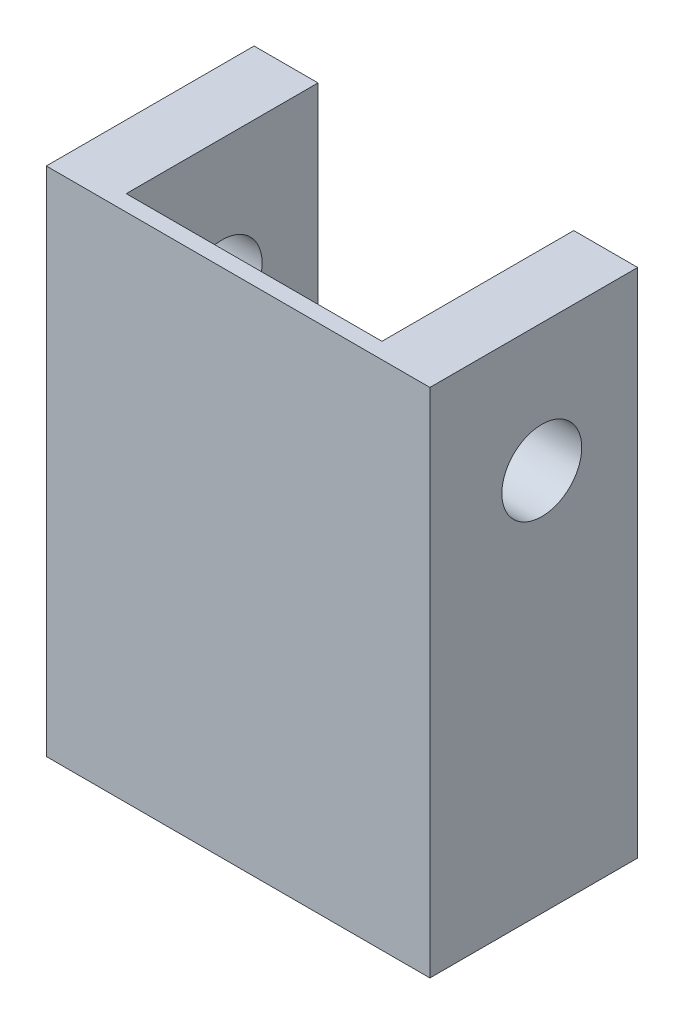
ISO-10303-21;
HEADER;
FILE_DESCRIPTION(('STEP AP214'),'2;1');
FILE_NAME('part.step','',(''),(''),'','','');
FILE_SCHEMA(('AUTOMOTIVE_DESIGN { 1 0 10303 214 1 1 1 1 }'));
ENDSEC;
DATA;
#1=APPLICATION_CONTEXT('core data for automotive mechanical design processes');
#2=APPLICATION_PROTOCOL_DEFINITION('international standard','automotive_design',2000,#1);
#3=PRODUCT_CONTEXT('',#1,'mechanical');
#4=PRODUCT('Part','Part','',(#3));
#5=PRODUCT_RELATED_PRODUCT_CATEGORY('part','',(#4));
#6=PRODUCT_DEFINITION_FORMATION('','',#4);
#7=PRODUCT_DEFINITION_CONTEXT('part definition',#1,'design');
#8=PRODUCT_DEFINITION('design','',#6,#7);
#9=PRODUCT_DEFINITION_SHAPE('','',#8);
#10=(LENGTH_UNIT() NAMED_UNIT(*) SI_UNIT(.MILLI.,.METRE.));
#11=(NAMED_UNIT(*) PLANE_ANGLE_UNIT() SI_UNIT($,.RADIAN.));
#12=(NAMED_UNIT(*) SI_UNIT($,.STERADIAN.) SOLID_ANGLE_UNIT());
#13=UNCERTAINTY_MEASURE_WITH_UNIT(LENGTH_MEASURE(1.E-05),#10,'distance_accuracy_value','');
#14=(GEOMETRIC_REPRESENTATION_CONTEXT(3) GLOBAL_UNCERTAINTY_ASSIGNED_CONTEXT((#13)) GLOBAL_UNIT_ASSIGNED_CONTEXT((#10,
#11,#12)) REPRESENTATION_CONTEXT('',''));
#15=CARTESIAN_POINT('',(0.,0.,0.));
#16=DIRECTION('',(0.,0.,1.));
#17=DIRECTION('',(1.,0.,0.));
#18=AXIS2_PLACEMENT_3D('',#15,#16,#17);
#19=CARTESIAN_POINT('',(38.1,0.,19.05));
#20=DIRECTION('',(-1.,0.,0.));
#21=DIRECTION('',(0.,-1.,0.));
#22=AXIS2_PLACEMENT_3D('',#19,#20,#21);
#23=PLANE('',#22);
#24=CARTESIAN_POINT('',(38.1,76.2,0.));
#25=DIRECTION('',(1.,0.,0.));
#26=DIRECTION('',(0.,0.,-1.));
#27=AXIS2_PLACEMENT_3D('',#24,#25,#26);
#28=CIRCLE('',#27,7.9375);
#29=CARTESIAN_POINT('',(38.1,76.2,-7.9375));
#30=VERTEX_POINT('',#29);
#31=EDGE_CURVE('E130',#30,#30,#28,.T.);
#32=ORIENTED_EDGE('',*,*,#31,.F.);
#33=EDGE_LOOP('',(#32));
#34=FACE_BOUND('',#33,.T.);
#35=DIRECTION('',(0.,1.,0.));
#36=VECTOR('',#35,1.);
#37=CARTESIAN_POINT('',(38.1,0.,-19.05));
#38=LINE('',#37,#36);
#39=CARTESIAN_POINT('',(38.1,0.,-19.05));
#40=VERTEX_POINT('',#39);
#41=CARTESIAN_POINT('',(38.1,101.6,-19.05));
#42=VERTEX_POINT('',#41);
#43=EDGE_CURVE('E143',#40,#42,#38,.T.);
#44=ORIENTED_EDGE('',*,*,#43,.T.);
#45=DIRECTION('',(0.,0.,-1.));
#46=VECTOR('',#45,1.);
#47=CARTESIAN_POINT('',(38.1,101.6,19.05));
#48=LINE('',#47,#46);
#49=CARTESIAN_POINT('',(38.1,101.6,22.225));
#50=VERTEX_POINT('',#49);
#51=EDGE_CURVE('E11',#50,#42,#48,.T.);
#52=ORIENTED_EDGE('',*,*,#51,.F.);
#53=DIRECTION('',(0.,1.,0.));
#54=VECTOR('',#53,1.);
#55=CARTESIAN_POINT('',(38.1,101.6,22.225));
#56=LINE('',#55,#54);
#57=CARTESIAN_POINT('',(38.1,0.,22.225));
#58=VERTEX_POINT('',#57);
#59=EDGE_CURVE('E119',#58,#50,#56,.T.);
#60=ORIENTED_EDGE('',*,*,#59,.F.);
#61=DIRECTION('',(0.,0.,-1.));
#62=VECTOR('',#61,1.);
#63=CARTESIAN_POINT('',(38.1,0.,19.05));
#64=LINE('',#63,#62);
#65=EDGE_CURVE('E111',#58,#40,#64,.T.);
#66=ORIENTED_EDGE('',*,*,#65,.T.);
#67=EDGE_LOOP('',(#44,#52,#60,#66));
#68=FACE_BOUND('',#67,.T.);
#69=ADVANCED_FACE('F33',(#34,#68),#23,.F.);
#70=CARTESIAN_POINT('',(25.4,101.6,19.05));
#71=DIRECTION('',(1.,0.,0.));
#72=DIRECTION('',(0.,0.,-1.));
#73=AXIS2_PLACEMENT_3D('',#70,#71,#72);
#74=PLANE('',#73);
#75=CARTESIAN_POINT('',(25.4,76.2,0.));
#76=DIRECTION('',(1.,0.,0.));
#77=DIRECTION('',(0.,0.,-1.));
#78=AXIS2_PLACEMENT_3D('',#75,#76,#77);
#79=CIRCLE('',#78,7.9375);
#80=CARTESIAN_POINT('',(25.4,76.2,-7.9375));
#81=VERTEX_POINT('',#80);
#82=EDGE_CURVE('E140',#81,#81,#79,.T.);
#83=ORIENTED_EDGE('',*,*,#82,.T.);
#84=EDGE_LOOP('',(#83));
#85=FACE_BOUND('',#84,.T.);
#86=DIRECTION('',(0.,-1.,0.));
#87=VECTOR('',#86,1.);
#88=CARTESIAN_POINT('',(25.4,101.6,-19.05));
#89=LINE('',#88,#87);
#90=CARTESIAN_POINT('',(25.4,101.6,-19.05));
#91=VERTEX_POINT('',#90);
#92=CARTESIAN_POINT('',(25.4,50.8,-19.05));
#93=VERTEX_POINT('',#92);
#94=EDGE_CURVE('E157',#91,#93,#89,.T.);
#95=ORIENTED_EDGE('',*,*,#94,.T.);
#96=DIRECTION('',(0.,0.,-1.));
#97=VECTOR('',#96,1.);
#98=CARTESIAN_POINT('',(25.4,50.8,19.05));
#99=LINE('',#98,#97);
#100=CARTESIAN_POINT('',(25.4,50.8,19.05));
#101=VERTEX_POINT('',#100);
#102=EDGE_CURVE('E173',#101,#93,#99,.T.);
#103=ORIENTED_EDGE('',*,*,#102,.F.);
#104=DIRECTION('',(0.,-1.,0.));
#105=VECTOR('',#104,1.);
#106=CARTESIAN_POINT('',(25.4,101.6,19.05));
#107=LINE('',#106,#105);
#108=CARTESIAN_POINT('',(25.4,101.6,19.05));
#109=VERTEX_POINT('',#108);
#110=EDGE_CURVE('E144',#109,#101,#107,.T.);
#111=ORIENTED_EDGE('',*,*,#110,.F.);
#112=DIRECTION('',(0.,0.,-1.));
#113=VECTOR('',#112,1.);
#114=CARTESIAN_POINT('',(25.4,101.6,19.05));
#115=LINE('',#114,#113);
#116=EDGE_CURVE('E41',#109,#91,#115,.T.);
#117=ORIENTED_EDGE('',*,*,#116,.T.);
#118=EDGE_LOOP('',(#95,#103,#111,#117));
#119=FACE_BOUND('',#118,.T.);
#120=ADVANCED_FACE('F177',(#85,#119),#74,.F.);
#121=CARTESIAN_POINT('',(25.4,50.8,19.05));
#122=DIRECTION('',(0.,-1.,0.));
#123=DIRECTION('',(1.,0.,0.));
#124=AXIS2_PLACEMENT_3D('',#121,#122,#123);
#125=PLANE('',#124);
#126=DIRECTION('',(-1.,0.,0.));
#127=VECTOR('',#126,1.);
#128=CARTESIAN_POINT('',(25.4,50.8,-19.05));
#129=LINE('',#128,#127);
#130=CARTESIAN_POINT('',(-25.4,50.8,-19.05));
#131=VERTEX_POINT('',#130);
#132=EDGE_CURVE('E159',#93,#131,#129,.T.);
#133=ORIENTED_EDGE('',*,*,#132,.T.);
#134=DIRECTION('',(0.,0.,-1.));
#135=VECTOR('',#134,1.);
#136=CARTESIAN_POINT('',(-25.4,50.8,19.05));
#137=LINE('',#136,#135);
#138=CARTESIAN_POINT('',(-25.4,50.8,19.05));
#139=VERTEX_POINT('',#138);
#140=EDGE_CURVE('E49',#139,#131,#137,.T.);
#141=ORIENTED_EDGE('',*,*,#140,.F.);
#142=DIRECTION('',(-1.,0.,0.));
#143=VECTOR('',#142,1.);
#144=CARTESIAN_POINT('',(25.4,50.8,19.05));
#145=LINE('',#144,#143);
#146=EDGE_CURVE('E147',#101,#139,#145,.T.);
#147=ORIENTED_EDGE('',*,*,#146,.F.);
#148=ORIENTED_EDGE('',*,*,#102,.T.);
#149=EDGE_LOOP('',(#133,#141,#147,#148));
#150=FACE_BOUND('',#149,.T.);
#151=ADVANCED_FACE('F185',(#150),#125,.F.);
#152=CARTESIAN_POINT('',(-25.4,101.6,19.05));
#153=DIRECTION('',(-1.,0.,0.));
#154=DIRECTION('',(0.,-1.,0.));
#155=AXIS2_PLACEMENT_3D('',#152,#153,#154);
#156=PLANE('',#155);
#157=CARTESIAN_POINT('',(-25.4,76.2,0.));
#158=DIRECTION('',(-1.,0.,0.));
#159=DIRECTION('',(0.,-1.,0.));
#160=AXIS2_PLACEMENT_3D('',#157,#158,#159);
#161=CIRCLE('',#160,7.9375);
#162=CARTESIAN_POINT('',(-25.4,68.2625,0.));
#163=VERTEX_POINT('',#162);
#164=EDGE_CURVE('E137',#163,#163,#161,.T.);
#165=ORIENTED_EDGE('',*,*,#164,.T.);
#166=EDGE_LOOP('',(#165));
#167=FACE_BOUND('',#166,.T.);
#168=DIRECTION('',(0.,1.,0.));
#169=VECTOR('',#168,1.);
#170=CARTESIAN_POINT('',(-25.4,101.6,-19.05));
#171=LINE('',#170,#169);
#172=CARTESIAN_POINT('',(-25.4,101.6,-19.05));
#173=VERTEX_POINT('',#172);
#174=EDGE_CURVE('E161',#131,#173,#171,.T.);
#175=ORIENTED_EDGE('',*,*,#174,.T.);
#176=DIRECTION('',(0.,0.,-1.));
#177=VECTOR('',#176,1.);
#178=CARTESIAN_POINT('',(-25.4,101.6,19.05));
#179=LINE('',#178,#177);
#180=CARTESIAN_POINT('',(-25.4,101.6,19.05));
#181=VERTEX_POINT('',#180);
#182=EDGE_CURVE('E169',#181,#173,#179,.T.);
#183=ORIENTED_EDGE('',*,*,#182,.F.);
#184=DIRECTION('',(0.,1.,0.));
#185=VECTOR('',#184,1.);
#186=CARTESIAN_POINT('',(-25.4,101.6,19.05));
#187=LINE('',#186,#185);
#188=EDGE_CURVE('E150',#139,#181,#187,.T.);
#189=ORIENTED_EDGE('',*,*,#188,.F.);
#190=ORIENTED_EDGE('',*,*,#140,.T.);
#191=EDGE_LOOP('',(#175,#183,#189,#190));
#192=FACE_BOUND('',#191,.T.);
#193=ADVANCED_FACE('F187',(#167,#192),#156,.F.);
#194=CARTESIAN_POINT('',(-38.1,101.6,19.05));
#195=DIRECTION('',(0.,-1.,0.));
#196=DIRECTION('',(1.,0.,0.));
#197=AXIS2_PLACEMENT_3D('',#194,#195,#196);
#198=PLANE('',#197);
#199=DIRECTION('',(-1.,0.,0.));
#200=VECTOR('',#199,1.);
#201=CARTESIAN_POINT('',(-38.1,101.6,-19.05));
#202=LINE('',#201,#200);
#203=CARTESIAN_POINT('',(-38.1,101.6,-19.05));
#204=VERTEX_POINT('',#203);
#205=EDGE_CURVE('E163',#173,#204,#202,.T.);
#206=ORIENTED_EDGE('',*,*,#205,.T.);
#207=DIRECTION('',(0.,0.,-1.));
#208=VECTOR('',#207,1.);
#209=CARTESIAN_POINT('',(-38.1,101.6,19.05));
#210=LINE('',#209,#208);
#211=CARTESIAN_POINT('',(-38.1,101.6,22.225));
#212=VERTEX_POINT('',#211);
#213=EDGE_CURVE('E110',#212,#204,#210,.T.);
#214=ORIENTED_EDGE('',*,*,#213,.F.);
#215=DIRECTION('',(-1.,0.,0.));
#216=VECTOR('',#215,1.);
#217=CARTESIAN_POINT('',(-38.1,101.6,22.225));
#218=LINE('',#217,#216);
#219=EDGE_CURVE('E124',#50,#212,#218,.T.);
#220=ORIENTED_EDGE('',*,*,#219,.F.);
#221=ORIENTED_EDGE('',*,*,#51,.T.);
#222=DIRECTION('',(-1.,0.,0.));
#223=VECTOR('',#222,1.);
#224=CARTESIAN_POINT('',(38.1,101.6,-19.05));
#225=LINE('',#224,#223);
#226=EDGE_CURVE('E155',#42,#91,#225,.T.);
#227=ORIENTED_EDGE('',*,*,#226,.T.);
#228=ORIENTED_EDGE('',*,*,#116,.F.);
#229=DIRECTION('',(-1.,0.,0.));
#230=VECTOR('',#229,1.);
#231=CARTESIAN_POINT('',(-38.1,101.6,19.05));
#232=LINE('',#231,#230);
#233=EDGE_CURVE('E125',#109,#181,#232,.T.);
#234=ORIENTED_EDGE('',*,*,#233,.T.);
#235=ORIENTED_EDGE('',*,*,#182,.T.);
#236=EDGE_LOOP('',(#206,#214,#220,#221,#227,#228,#234,#235));
#237=FACE_BOUND('',#236,.T.);
#238=ADVANCED_FACE('F190',(#237),#198,.F.);
#239=CARTESIAN_POINT('',(-38.1,0.,19.05));
#240=DIRECTION('',(1.,0.,0.));
#241=DIRECTION('',(0.,1.,0.));
#242=AXIS2_PLACEMENT_3D('',#239,#240,#241);
#243=PLANE('',#242);
#244=CARTESIAN_POINT('',(-38.1,76.2,0.));
#245=DIRECTION('',(1.,0.,0.));
#246=DIRECTION('',(0.,0.,-1.));
#247=AXIS2_PLACEMENT_3D('',#244,#245,#246);
#248=CIRCLE('',#247,7.9375);
#249=CARTESIAN_POINT('',(-38.1,76.2,-7.9375));
#250=VERTEX_POINT('',#249);
#251=EDGE_CURVE('E134',#250,#250,#248,.T.);
#252=ORIENTED_EDGE('',*,*,#251,.T.);
#253=EDGE_LOOP('',(#252));
#254=FACE_BOUND('',#253,.T.);
#255=DIRECTION('',(0.,-1.,0.));
#256=VECTOR('',#255,1.);
#257=CARTESIAN_POINT('',(-38.1,0.,-19.05));
#258=LINE('',#257,#256);
#259=CARTESIAN_POINT('',(-38.1,0.,-19.05));
#260=VERTEX_POINT('',#259);
#261=EDGE_CURVE('E79',#204,#260,#258,.T.);
#262=ORIENTED_EDGE('',*,*,#261,.T.);
#263=DIRECTION('',(0.,0.,-1.));
#264=VECTOR('',#263,1.);
#265=CARTESIAN_POINT('',(-38.1,0.,19.05));
#266=LINE('',#265,#264);
#267=CARTESIAN_POINT('',(-38.1,0.,22.225));
#268=VERTEX_POINT('',#267);
#269=EDGE_CURVE('E105',#268,#260,#266,.T.);
#270=ORIENTED_EDGE('',*,*,#269,.F.);
#271=DIRECTION('',(0.,-1.,0.));
#272=VECTOR('',#271,1.);
#273=CARTESIAN_POINT('',(-38.1,101.6,22.225));
#274=LINE('',#273,#272);
#275=EDGE_CURVE('E109',#212,#268,#274,.T.);
#276=ORIENTED_EDGE('',*,*,#275,.F.);
#277=ORIENTED_EDGE('',*,*,#213,.T.);
#278=EDGE_LOOP('',(#262,#270,#276,#277));
#279=FACE_BOUND('',#278,.T.);
#280=ADVANCED_FACE('F107',(#254,#279),#243,.F.);
#281=CARTESIAN_POINT('',(-38.1,0.,19.05));
#282=DIRECTION('',(0.,1.,0.));
#283=DIRECTION('',(-1.,0.,0.));
#284=AXIS2_PLACEMENT_3D('',#281,#282,#283);
#285=PLANE('',#284);
#286=DIRECTION('',(1.,0.,0.));
#287=VECTOR('',#286,1.);
#288=CARTESIAN_POINT('',(-38.1,0.,-19.05));
#289=LINE('',#288,#287);
#290=EDGE_CURVE('E85',#260,#40,#289,.T.);
#291=ORIENTED_EDGE('',*,*,#290,.T.);
#292=ORIENTED_EDGE('',*,*,#65,.F.);
#293=DIRECTION('',(1.,0.,0.));
#294=VECTOR('',#293,1.);
#295=CARTESIAN_POINT('',(-38.1,0.,22.225));
#296=LINE('',#295,#294);
#297=EDGE_CURVE('E114',#268,#58,#296,.T.);
#298=ORIENTED_EDGE('',*,*,#297,.F.);
#299=ORIENTED_EDGE('',*,*,#269,.T.);
#300=EDGE_LOOP('',(#291,#292,#298,#299));
#301=FACE_BOUND('',#300,.T.);
#302=ADVANCED_FACE('F115',(#301),#285,.F.);
#303=CARTESIAN_POINT('',(0.,0.,-19.05));
#304=DIRECTION('',(0.,0.,1.));
#305=DIRECTION('',(1.,0.,0.));
#306=AXIS2_PLACEMENT_3D('',#303,#304,#305);
#307=PLANE('',#306);
#308=ORIENTED_EDGE('',*,*,#43,.F.);
#309=ORIENTED_EDGE('',*,*,#290,.F.);
#310=ORIENTED_EDGE('',*,*,#261,.F.);
#311=ORIENTED_EDGE('',*,*,#205,.F.);
#312=ORIENTED_EDGE('',*,*,#174,.F.);
#313=ORIENTED_EDGE('',*,*,#132,.F.);
#314=ORIENTED_EDGE('',*,*,#94,.F.);
#315=ORIENTED_EDGE('',*,*,#226,.F.);
#316=EDGE_LOOP('',(#308,#309,#310,#311,#312,#313,#314,#315));
#317=FACE_BOUND('',#316,.T.);
#318=ADVANCED_FACE('F182',(#317),#307,.F.);
#319=CARTESIAN_POINT('',(-38.1,76.2,0.));
#320=DIRECTION('',(1.,0.,0.));
#321=DIRECTION('',(0.,0.,-1.));
#322=AXIS2_PLACEMENT_3D('',#319,#320,#321);
#323=CYLINDRICAL_SURFACE('',#322,7.9375);
#324=ORIENTED_EDGE('',*,*,#251,.F.);
#325=EDGE_LOOP('',(#324));
#326=FACE_BOUND('',#325,.T.);
#327=ORIENTED_EDGE('',*,*,#164,.F.);
#328=EDGE_LOOP('',(#327));
#329=FACE_BOUND('',#328,.T.);
#330=ADVANCED_FACE('F203',(#326,#329),#323,.F.);
#331=ORIENTED_EDGE('',*,*,#31,.T.);
#332=EDGE_LOOP('',(#331));
#333=FACE_BOUND('',#332,.T.);
#334=ORIENTED_EDGE('',*,*,#82,.F.);
#335=EDGE_LOOP('',(#334));
#336=FACE_BOUND('',#335,.T.);
#337=ADVANCED_FACE('F200',(#333,#336),#323,.F.);
#338=CARTESIAN_POINT('',(0.,0.,19.05));
#339=DIRECTION('',(0.,0.,1.));
#340=DIRECTION('',(1.,0.,0.));
#341=AXIS2_PLACEMENT_3D('',#338,#339,#340);
#342=PLANE('',#341);
#343=ORIENTED_EDGE('',*,*,#233,.F.);
#344=ORIENTED_EDGE('',*,*,#110,.T.);
#345=ORIENTED_EDGE('',*,*,#146,.T.);
#346=ORIENTED_EDGE('',*,*,#188,.T.);
#347=EDGE_LOOP('',(#343,#344,#345,#346));
#348=FACE_BOUND('',#347,.T.);
#349=ADVANCED_FACE('F189',(#348),#342,.F.);
#350=CARTESIAN_POINT('',(0.,0.,22.225));
#351=DIRECTION('',(0.,0.,1.));
#352=DIRECTION('',(1.,0.,0.));
#353=AXIS2_PLACEMENT_3D('',#350,#351,#352);
#354=PLANE('',#353);
#355=ORIENTED_EDGE('',*,*,#275,.T.);
#356=ORIENTED_EDGE('',*,*,#297,.T.);
#357=ORIENTED_EDGE('',*,*,#59,.T.);
#358=ORIENTED_EDGE('',*,*,#219,.T.);
#359=EDGE_LOOP('',(#355,#356,#357,#358));
#360=FACE_BOUND('',#359,.T.);
#361=ADVANCED_FACE('F122',(#360),#354,.T.);
#362=CLOSED_SHELL('',(#69,#120,#151,#193,#238,#280,#302,#318,#330,#337,#349,#361));
#363=MANIFOLD_SOLID_BREP('B2',#362);
#364=ADVANCED_BREP_SHAPE_REPRESENTATION('',(#18,#363),#14);
#365=SHAPE_DEFINITION_REPRESENTATION(#9,#364);
ENDSEC;
END-ISO-10303-21;
